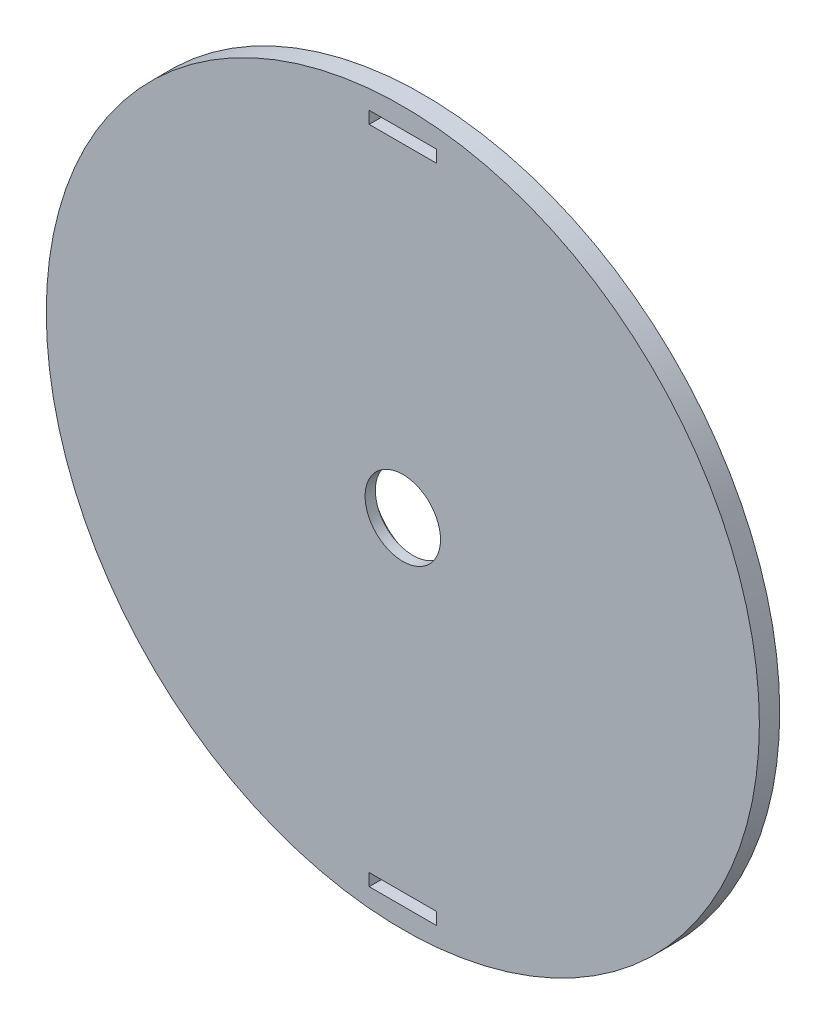
ISO-10303-21;
HEADER;
FILE_DESCRIPTION(('STEP AP214'),'2;1');
FILE_NAME('part.step','',(''),(''),'','','');
FILE_SCHEMA(('AUTOMOTIVE_DESIGN { 1 0 10303 214 1 1 1 1 }'));
ENDSEC;
DATA;
#1=APPLICATION_CONTEXT('core data for automotive mechanical design processes');
#2=APPLICATION_PROTOCOL_DEFINITION('international standard','automotive_design',2000,#1);
#3=PRODUCT_CONTEXT('',#1,'mechanical');
#4=PRODUCT('Part','Part','',(#3));
#5=PRODUCT_RELATED_PRODUCT_CATEGORY('part','',(#4));
#6=PRODUCT_DEFINITION_FORMATION('','',#4);
#7=PRODUCT_DEFINITION_CONTEXT('part definition',#1,'design');
#8=PRODUCT_DEFINITION('design','',#6,#7);
#9=PRODUCT_DEFINITION_SHAPE('','',#8);
#10=(LENGTH_UNIT() NAMED_UNIT(*) SI_UNIT(.MILLI.,.METRE.));
#11=(NAMED_UNIT(*) PLANE_ANGLE_UNIT() SI_UNIT($,.RADIAN.));
#12=(NAMED_UNIT(*) SI_UNIT($,.STERADIAN.) SOLID_ANGLE_UNIT());
#13=UNCERTAINTY_MEASURE_WITH_UNIT(LENGTH_MEASURE(1.E-05),#10,'distance_accuracy_value','');
#14=(GEOMETRIC_REPRESENTATION_CONTEXT(3) GLOBAL_UNCERTAINTY_ASSIGNED_CONTEXT((#13)) GLOBAL_UNIT_ASSIGNED_CONTEXT((#10,
#11,#12)) REPRESENTATION_CONTEXT('',''));
#15=CARTESIAN_POINT('',(0.,0.,0.));
#16=DIRECTION('',(0.,0.,1.));
#17=DIRECTION('',(1.,0.,0.));
#18=AXIS2_PLACEMENT_3D('',#15,#16,#17);
#19=CARTESIAN_POINT('',(0.,0.,5.));
#20=DIRECTION('',(0.,0.,-1.));
#21=DIRECTION('',(-1.,0.,0.));
#22=AXIS2_PLACEMENT_3D('',#19,#20,#21);
#23=CYLINDRICAL_SURFACE('',#22,87.5);
#24=CARTESIAN_POINT('',(0.,0.,5.));
#25=DIRECTION('',(0.,0.,1.));
#26=DIRECTION('',(1.,0.,0.));
#27=AXIS2_PLACEMENT_3D('',#24,#25,#26);
#28=CIRCLE('',#27,87.5);
#29=CARTESIAN_POINT('',(87.5,0.,5.));
#30=VERTEX_POINT('',#29);
#31=EDGE_CURVE('E11',#30,#30,#28,.T.);
#32=ORIENTED_EDGE('',*,*,#31,.F.);
#33=EDGE_LOOP('',(#32));
#34=FACE_BOUND('',#33,.T.);
#35=CARTESIAN_POINT('',(0.,0.,0.));
#36=DIRECTION('',(0.,0.,1.));
#37=DIRECTION('',(1.,0.,0.));
#38=AXIS2_PLACEMENT_3D('',#35,#36,#37);
#39=CIRCLE('',#38,87.5);
#40=CARTESIAN_POINT('',(87.5,0.,0.));
#41=VERTEX_POINT('',#40);
#42=EDGE_CURVE('E44',#41,#41,#39,.T.);
#43=ORIENTED_EDGE('',*,*,#42,.T.);
#44=EDGE_LOOP('',(#43));
#45=FACE_BOUND('',#44,.T.);
#46=ADVANCED_FACE('F41',(#34,#45),#23,.T.);
#47=CARTESIAN_POINT('',(0.,0.,5.));
#48=DIRECTION('',(0.,0.,1.));
#49=DIRECTION('',(1.,0.,0.));
#50=AXIS2_PLACEMENT_3D('',#47,#48,#49);
#51=PLANE('',#50);
#52=CARTESIAN_POINT('',(0.,0.,5.));
#53=DIRECTION('',(0.,0.,1.));
#54=DIRECTION('',(1.,0.,0.));
#55=AXIS2_PLACEMENT_3D('',#52,#53,#54);
#56=CIRCLE('',#55,9.25);
#57=CARTESIAN_POINT('',(9.25,0.,5.));
#58=VERTEX_POINT('',#57);
#59=EDGE_CURVE('E180',#58,#58,#56,.T.);
#60=ORIENTED_EDGE('',*,*,#59,.F.);
#61=EDGE_LOOP('',(#60));
#62=FACE_BOUND('',#61,.T.);
#63=DIRECTION('',(0.,1.,0.));
#64=VECTOR('',#63,1.);
#65=CARTESIAN_POINT('',(8.25,0.,5.));
#66=LINE('',#65,#64);
#67=CARTESIAN_POINT('',(8.25,-82.5,5.));
#68=VERTEX_POINT('',#67);
#69=CARTESIAN_POINT('',(8.25,-79.5,5.));
#70=VERTEX_POINT('',#69);
#71=EDGE_CURVE('E247',#68,#70,#66,.T.);
#72=ORIENTED_EDGE('',*,*,#71,.F.);
#73=DIRECTION('',(1.,0.,0.));
#74=VECTOR('',#73,1.);
#75=CARTESIAN_POINT('',(0.,-82.5,5.));
#76=LINE('',#75,#74);
#77=CARTESIAN_POINT('',(-8.25,-82.5,5.));
#78=VERTEX_POINT('',#77);
#79=EDGE_CURVE('E234',#78,#68,#76,.T.);
#80=ORIENTED_EDGE('',*,*,#79,.F.);
#81=DIRECTION('',(0.,-1.,0.));
#82=VECTOR('',#81,1.);
#83=CARTESIAN_POINT('',(-8.25,0.,5.));
#84=LINE('',#83,#82);
#85=CARTESIAN_POINT('',(-8.25,-79.5,5.));
#86=VERTEX_POINT('',#85);
#87=EDGE_CURVE('E242',#86,#78,#84,.T.);
#88=ORIENTED_EDGE('',*,*,#87,.F.);
#89=DIRECTION('',(-1.,0.,0.));
#90=VECTOR('',#89,1.);
#91=CARTESIAN_POINT('',(0.,-79.5,5.));
#92=LINE('',#91,#90);
#93=EDGE_CURVE('E245',#70,#86,#92,.T.);
#94=ORIENTED_EDGE('',*,*,#93,.F.);
#95=EDGE_LOOP('',(#72,#80,#88,#94));
#96=FACE_BOUND('',#95,.T.);
#97=DIRECTION('',(0.,-1.,0.));
#98=VECTOR('',#97,1.);
#99=CARTESIAN_POINT('',(-8.25,0.,5.));
#100=LINE('',#99,#98);
#101=CARTESIAN_POINT('',(-8.25,82.5,5.));
#102=VERTEX_POINT('',#101);
#103=CARTESIAN_POINT('',(-8.25,79.5,5.));
#104=VERTEX_POINT('',#103);
#105=EDGE_CURVE('E278',#102,#104,#100,.T.);
#106=ORIENTED_EDGE('',*,*,#105,.F.);
#107=DIRECTION('',(-1.,0.,0.));
#108=VECTOR('',#107,1.);
#109=CARTESIAN_POINT('',(0.,82.5,5.));
#110=LINE('',#109,#108);
#111=CARTESIAN_POINT('',(8.25,82.5,5.));
#112=VERTEX_POINT('',#111);
#113=EDGE_CURVE('E265',#112,#102,#110,.T.);
#114=ORIENTED_EDGE('',*,*,#113,.F.);
#115=DIRECTION('',(0.,1.,0.));
#116=VECTOR('',#115,1.);
#117=CARTESIAN_POINT('',(8.25,0.,5.));
#118=LINE('',#117,#116);
#119=CARTESIAN_POINT('',(8.25,79.5,5.));
#120=VERTEX_POINT('',#119);
#121=EDGE_CURVE('E273',#120,#112,#118,.T.);
#122=ORIENTED_EDGE('',*,*,#121,.F.);
#123=DIRECTION('',(1.,0.,0.));
#124=VECTOR('',#123,1.);
#125=CARTESIAN_POINT('',(0.,79.5,5.));
#126=LINE('',#125,#124);
#127=EDGE_CURVE('E276',#104,#120,#126,.T.);
#128=ORIENTED_EDGE('',*,*,#127,.F.);
#129=EDGE_LOOP('',(#106,#114,#122,#128));
#130=FACE_BOUND('',#129,.T.);
#131=ORIENTED_EDGE('',*,*,#31,.T.);
#132=EDGE_LOOP('',(#131));
#133=FACE_BOUND('',#132,.T.);
#134=ADVANCED_FACE('F290',(#62,#96,#130,#133),#51,.T.);
#135=CARTESIAN_POINT('',(0.,0.,0.));
#136=DIRECTION('',(0.,0.,1.));
#137=DIRECTION('',(1.,0.,0.));
#138=AXIS2_PLACEMENT_3D('',#135,#136,#137);
#139=PLANE('',#138);
#140=CARTESIAN_POINT('',(0.,0.,0.));
#141=DIRECTION('',(0.,0.,-1.));
#142=DIRECTION('',(-1.,0.,0.));
#143=AXIS2_PLACEMENT_3D('',#140,#141,#142);
#144=CIRCLE('',#143,12.6);
#145=CARTESIAN_POINT('',(-12.6,0.,0.));
#146=VERTEX_POINT('',#145);
#147=EDGE_CURVE('E483',#146,#146,#144,.T.);
#148=ORIENTED_EDGE('',*,*,#147,.F.);
#149=EDGE_LOOP('',(#148));
#150=FACE_BOUND('',#149,.T.);
#151=DIRECTION('',(1.,0.,0.));
#152=VECTOR('',#151,1.);
#153=CARTESIAN_POINT('',(-8.05,-49.5,0.));
#154=LINE('',#153,#152);
#155=CARTESIAN_POINT('',(-8.05,-49.5,0.));
#156=VERTEX_POINT('',#155);
#157=CARTESIAN_POINT('',(8.05,-49.5,0.));
#158=VERTEX_POINT('',#157);
#159=EDGE_CURVE('E177',#156,#158,#154,.T.);
#160=ORIENTED_EDGE('',*,*,#159,.F.);
#161=DIRECTION('',(0.,1.,0.));
#162=VECTOR('',#161,1.);
#163=CARTESIAN_POINT('',(-8.05,-79.5,0.));
#164=LINE('',#163,#162);
#165=CARTESIAN_POINT('',(-8.05,-79.5,0.));
#166=VERTEX_POINT('',#165);
#167=EDGE_CURVE('E162',#166,#156,#164,.T.);
#168=ORIENTED_EDGE('',*,*,#167,.F.);
#169=DIRECTION('',(1.,0.,0.));
#170=VECTOR('',#169,1.);
#171=CARTESIAN_POINT('',(-8.25,-79.5,0.));
#172=LINE('',#171,#170);
#173=CARTESIAN_POINT('',(-8.25,-79.5,0.));
#174=VERTEX_POINT('',#173);
#175=EDGE_CURVE('E227',#174,#166,#172,.T.);
#176=ORIENTED_EDGE('',*,*,#175,.F.);
#177=DIRECTION('',(0.,1.,0.));
#178=VECTOR('',#177,1.);
#179=CARTESIAN_POINT('',(-8.25,-82.5,0.));
#180=LINE('',#179,#178);
#181=CARTESIAN_POINT('',(-8.25,-82.5,0.));
#182=VERTEX_POINT('',#181);
#183=EDGE_CURVE('E223',#182,#174,#180,.T.);
#184=ORIENTED_EDGE('',*,*,#183,.F.);
#185=DIRECTION('',(-1.,0.,0.));
#186=VECTOR('',#185,1.);
#187=CARTESIAN_POINT('',(-8.25,-82.5,0.));
#188=LINE('',#187,#186);
#189=CARTESIAN_POINT('',(8.25,-82.5,0.));
#190=VERTEX_POINT('',#189);
#191=EDGE_CURVE('E220',#190,#182,#188,.T.);
#192=ORIENTED_EDGE('',*,*,#191,.F.);
#193=DIRECTION('',(0.,-1.,0.));
#194=VECTOR('',#193,1.);
#195=CARTESIAN_POINT('',(8.25,-82.5,0.));
#196=LINE('',#195,#194);
#197=CARTESIAN_POINT('',(8.25,-79.5,0.));
#198=VERTEX_POINT('',#197);
#199=EDGE_CURVE('E212',#198,#190,#196,.T.);
#200=ORIENTED_EDGE('',*,*,#199,.F.);
#201=CARTESIAN_POINT('',(8.05,-79.5,0.));
#202=VERTEX_POINT('',#201);
#203=EDGE_CURVE('E226',#202,#198,#172,.T.);
#204=ORIENTED_EDGE('',*,*,#203,.F.);
#205=DIRECTION('',(0.,-1.,0.));
#206=VECTOR('',#205,1.);
#207=CARTESIAN_POINT('',(8.05,-79.5,0.));
#208=LINE('',#207,#206);
#209=EDGE_CURVE('E175',#158,#202,#208,.T.);
#210=ORIENTED_EDGE('',*,*,#209,.F.);
#211=EDGE_LOOP('',(#160,#168,#176,#184,#192,#200,#204,#210));
#212=FACE_BOUND('',#211,.T.);
#213=DIRECTION('',(-1.,0.,0.));
#214=VECTOR('',#213,1.);
#215=CARTESIAN_POINT('',(8.05,49.5,0.));
#216=LINE('',#215,#214);
#217=CARTESIAN_POINT('',(8.05,49.5,0.));
#218=VERTEX_POINT('',#217);
#219=CARTESIAN_POINT('',(-8.05,49.5,0.));
#220=VERTEX_POINT('',#219);
#221=EDGE_CURVE('E206',#218,#220,#216,.T.);
#222=ORIENTED_EDGE('',*,*,#221,.F.);
#223=DIRECTION('',(0.,-1.,0.));
#224=VECTOR('',#223,1.);
#225=CARTESIAN_POINT('',(8.05,79.5,0.));
#226=LINE('',#225,#224);
#227=CARTESIAN_POINT('',(8.05,79.5,0.));
#228=VERTEX_POINT('',#227);
#229=EDGE_CURVE('E189',#228,#218,#226,.T.);
#230=ORIENTED_EDGE('',*,*,#229,.F.);
#231=DIRECTION('',(-1.,0.,0.));
#232=VECTOR('',#231,1.);
#233=CARTESIAN_POINT('',(8.25,79.5,0.));
#234=LINE('',#233,#232);
#235=CARTESIAN_POINT('',(8.25,79.5,0.));
#236=VERTEX_POINT('',#235);
#237=EDGE_CURVE('E258',#236,#228,#234,.T.);
#238=ORIENTED_EDGE('',*,*,#237,.F.);
#239=DIRECTION('',(0.,-1.,0.));
#240=VECTOR('',#239,1.);
#241=CARTESIAN_POINT('',(8.25,82.5,0.));
#242=LINE('',#241,#240);
#243=CARTESIAN_POINT('',(8.25,82.5,0.));
#244=VERTEX_POINT('',#243);
#245=EDGE_CURVE('E254',#244,#236,#242,.T.);
#246=ORIENTED_EDGE('',*,*,#245,.F.);
#247=DIRECTION('',(1.,0.,0.));
#248=VECTOR('',#247,1.);
#249=CARTESIAN_POINT('',(8.25,82.5,0.));
#250=LINE('',#249,#248);
#251=CARTESIAN_POINT('',(-8.25,82.5,0.));
#252=VERTEX_POINT('',#251);
#253=EDGE_CURVE('E251',#252,#244,#250,.T.);
#254=ORIENTED_EDGE('',*,*,#253,.F.);
#255=DIRECTION('',(0.,1.,0.));
#256=VECTOR('',#255,1.);
#257=CARTESIAN_POINT('',(-8.25,82.5,0.));
#258=LINE('',#257,#256);
#259=CARTESIAN_POINT('',(-8.25,79.5,0.));
#260=VERTEX_POINT('',#259);
#261=EDGE_CURVE('E249',#260,#252,#258,.T.);
#262=ORIENTED_EDGE('',*,*,#261,.F.);
#263=CARTESIAN_POINT('',(-8.05,79.5,0.));
#264=VERTEX_POINT('',#263);
#265=EDGE_CURVE('E257',#264,#260,#234,.T.);
#266=ORIENTED_EDGE('',*,*,#265,.F.);
#267=DIRECTION('',(0.,1.,0.));
#268=VECTOR('',#267,1.);
#269=CARTESIAN_POINT('',(-8.05,79.5,0.));
#270=LINE('',#269,#268);
#271=EDGE_CURVE('E198',#220,#264,#270,.T.);
#272=ORIENTED_EDGE('',*,*,#271,.F.);
#273=EDGE_LOOP('',(#222,#230,#238,#246,#254,#262,#266,#272));
#274=FACE_BOUND('',#273,.T.);
#275=ORIENTED_EDGE('',*,*,#42,.F.);
#276=EDGE_LOOP('',(#275));
#277=FACE_BOUND('',#276,.T.);
#278=ADVANCED_FACE('F287',(#150,#212,#274,#277),#139,.F.);
#279=CARTESIAN_POINT('',(-8.25,82.5,10.));
#280=DIRECTION('',(-1.,0.,0.));
#281=DIRECTION('',(0.,0.,1.));
#282=AXIS2_PLACEMENT_3D('',#279,#280,#281);
#283=PLANE('',#282);
#284=ORIENTED_EDGE('',*,*,#105,.T.);
#285=DIRECTION('',(0.,0.,-1.));
#286=VECTOR('',#285,1.);
#287=CARTESIAN_POINT('',(-8.25,79.5,10.));
#288=LINE('',#287,#286);
#289=EDGE_CURVE('E262',#104,#260,#288,.T.);
#290=ORIENTED_EDGE('',*,*,#289,.T.);
#291=ORIENTED_EDGE('',*,*,#261,.T.);
#292=DIRECTION('',(0.,0.,-1.));
#293=VECTOR('',#292,1.);
#294=CARTESIAN_POINT('',(-8.25,82.5,10.));
#295=LINE('',#294,#293);
#296=EDGE_CURVE('E261',#102,#252,#295,.T.);
#297=ORIENTED_EDGE('',*,*,#296,.F.);
#298=EDGE_LOOP('',(#284,#290,#291,#297));
#299=FACE_BOUND('',#298,.T.);
#300=ADVANCED_FACE('F289',(#299),#283,.F.);
#301=CARTESIAN_POINT('',(8.25,79.5,10.));
#302=DIRECTION('',(0.,-1.,0.));
#303=DIRECTION('',(0.,0.,-1.));
#304=AXIS2_PLACEMENT_3D('',#301,#302,#303);
#305=PLANE('',#304);
#306=ORIENTED_EDGE('',*,*,#237,.T.);
#307=DIRECTION('',(0.,0.,-1.));
#308=VECTOR('',#307,1.);
#309=CARTESIAN_POINT('',(8.05,79.5,2.));
#310=LINE('',#309,#308);
#311=CARTESIAN_POINT('',(8.05,79.5,2.));
#312=VERTEX_POINT('',#311);
#313=EDGE_CURVE('E210',#312,#228,#310,.T.);
#314=ORIENTED_EDGE('',*,*,#313,.F.);
#315=DIRECTION('',(1.,0.,0.));
#316=VECTOR('',#315,1.);
#317=CARTESIAN_POINT('',(8.05,79.5,2.));
#318=LINE('',#317,#316);
#319=CARTESIAN_POINT('',(-8.05,79.5,2.));
#320=VERTEX_POINT('',#319);
#321=EDGE_CURVE('E201',#320,#312,#318,.T.);
#322=ORIENTED_EDGE('',*,*,#321,.F.);
#323=DIRECTION('',(0.,0.,-1.));
#324=VECTOR('',#323,1.);
#325=CARTESIAN_POINT('',(-8.05,79.5,2.));
#326=LINE('',#325,#324);
#327=EDGE_CURVE('E213',#320,#264,#326,.T.);
#328=ORIENTED_EDGE('',*,*,#327,.T.);
#329=ORIENTED_EDGE('',*,*,#265,.T.);
#330=ORIENTED_EDGE('',*,*,#289,.F.);
#331=ORIENTED_EDGE('',*,*,#127,.T.);
#332=DIRECTION('',(0.,0.,-1.));
#333=VECTOR('',#332,1.);
#334=CARTESIAN_POINT('',(8.25,79.5,10.));
#335=LINE('',#334,#333);
#336=EDGE_CURVE('E266',#120,#236,#335,.T.);
#337=ORIENTED_EDGE('',*,*,#336,.T.);
#338=EDGE_LOOP('',(#306,#314,#322,#328,#329,#330,#331,#337));
#339=FACE_BOUND('',#338,.T.);
#340=ADVANCED_FACE('F297',(#339),#305,.F.);
#341=CARTESIAN_POINT('',(8.25,82.5,10.));
#342=DIRECTION('',(1.,0.,0.));
#343=DIRECTION('',(0.,0.,-1.));
#344=AXIS2_PLACEMENT_3D('',#341,#342,#343);
#345=PLANE('',#344);
#346=ORIENTED_EDGE('',*,*,#121,.T.);
#347=DIRECTION('',(0.,0.,-1.));
#348=VECTOR('',#347,1.);
#349=CARTESIAN_POINT('',(8.25,82.5,10.));
#350=LINE('',#349,#348);
#351=EDGE_CURVE('E268',#112,#244,#350,.T.);
#352=ORIENTED_EDGE('',*,*,#351,.T.);
#353=ORIENTED_EDGE('',*,*,#245,.T.);
#354=ORIENTED_EDGE('',*,*,#336,.F.);
#355=EDGE_LOOP('',(#346,#352,#353,#354));
#356=FACE_BOUND('',#355,.T.);
#357=ADVANCED_FACE('F321',(#356),#345,.F.);
#358=CARTESIAN_POINT('',(8.25,82.5,10.));
#359=DIRECTION('',(0.,1.,0.));
#360=DIRECTION('',(0.,0.,1.));
#361=AXIS2_PLACEMENT_3D('',#358,#359,#360);
#362=PLANE('',#361);
#363=ORIENTED_EDGE('',*,*,#113,.T.);
#364=ORIENTED_EDGE('',*,*,#296,.T.);
#365=ORIENTED_EDGE('',*,*,#253,.T.);
#366=ORIENTED_EDGE('',*,*,#351,.F.);
#367=EDGE_LOOP('',(#363,#364,#365,#366));
#368=FACE_BOUND('',#367,.T.);
#369=ADVANCED_FACE('F325',(#368),#362,.F.);
#370=CARTESIAN_POINT('',(8.25,-82.5,10.));
#371=DIRECTION('',(1.,0.,0.));
#372=DIRECTION('',(0.,0.,-1.));
#373=AXIS2_PLACEMENT_3D('',#370,#371,#372);
#374=PLANE('',#373);
#375=ORIENTED_EDGE('',*,*,#71,.T.);
#376=DIRECTION('',(0.,0.,-1.));
#377=VECTOR('',#376,1.);
#378=CARTESIAN_POINT('',(8.25,-79.5,10.));
#379=LINE('',#378,#377);
#380=EDGE_CURVE('E231',#70,#198,#379,.T.);
#381=ORIENTED_EDGE('',*,*,#380,.T.);
#382=ORIENTED_EDGE('',*,*,#199,.T.);
#383=DIRECTION('',(0.,0.,-1.));
#384=VECTOR('',#383,1.);
#385=CARTESIAN_POINT('',(8.25,-82.5,10.));
#386=LINE('',#385,#384);
#387=EDGE_CURVE('E230',#68,#190,#386,.T.);
#388=ORIENTED_EDGE('',*,*,#387,.F.);
#389=EDGE_LOOP('',(#375,#381,#382,#388));
#390=FACE_BOUND('',#389,.T.);
#391=ADVANCED_FACE('F334',(#390),#374,.F.);
#392=CARTESIAN_POINT('',(-8.25,-79.5,10.));
#393=DIRECTION('',(0.,1.,0.));
#394=DIRECTION('',(0.,0.,1.));
#395=AXIS2_PLACEMENT_3D('',#392,#393,#394);
#396=PLANE('',#395);
#397=ORIENTED_EDGE('',*,*,#175,.T.);
#398=DIRECTION('',(0.,0.,-1.));
#399=VECTOR('',#398,1.);
#400=CARTESIAN_POINT('',(-8.05,-79.5,2.));
#401=LINE('',#400,#399);
#402=CARTESIAN_POINT('',(-8.05,-79.5,2.));
#403=VERTEX_POINT('',#402);
#404=EDGE_CURVE('E187',#403,#166,#401,.T.);
#405=ORIENTED_EDGE('',*,*,#404,.F.);
#406=DIRECTION('',(-1.,0.,0.));
#407=VECTOR('',#406,1.);
#408=CARTESIAN_POINT('',(-8.05,-79.5,2.));
#409=LINE('',#408,#407);
#410=CARTESIAN_POINT('',(8.05,-79.5,2.));
#411=VERTEX_POINT('',#410);
#412=EDGE_CURVE('E167',#411,#403,#409,.T.);
#413=ORIENTED_EDGE('',*,*,#412,.F.);
#414=DIRECTION('',(0.,0.,-1.));
#415=VECTOR('',#414,1.);
#416=CARTESIAN_POINT('',(8.05,-79.5,2.));
#417=LINE('',#416,#415);
#418=EDGE_CURVE('E190',#411,#202,#417,.T.);
#419=ORIENTED_EDGE('',*,*,#418,.T.);
#420=ORIENTED_EDGE('',*,*,#203,.T.);
#421=ORIENTED_EDGE('',*,*,#380,.F.);
#422=ORIENTED_EDGE('',*,*,#93,.T.);
#423=DIRECTION('',(0.,0.,-1.));
#424=VECTOR('',#423,1.);
#425=CARTESIAN_POINT('',(-8.25,-79.5,10.));
#426=LINE('',#425,#424);
#427=EDGE_CURVE('E235',#86,#174,#426,.T.);
#428=ORIENTED_EDGE('',*,*,#427,.T.);
#429=EDGE_LOOP('',(#397,#405,#413,#419,#420,#421,#422,#428));
#430=FACE_BOUND('',#429,.T.);
#431=ADVANCED_FACE('F343',(#430),#396,.F.);
#432=CARTESIAN_POINT('',(-8.25,-82.5,10.));
#433=DIRECTION('',(-1.,0.,0.));
#434=DIRECTION('',(0.,0.,1.));
#435=AXIS2_PLACEMENT_3D('',#432,#433,#434);
#436=PLANE('',#435);
#437=ORIENTED_EDGE('',*,*,#87,.T.);
#438=DIRECTION('',(0.,0.,-1.));
#439=VECTOR('',#438,1.);
#440=CARTESIAN_POINT('',(-8.25,-82.5,10.));
#441=LINE('',#440,#439);
#442=EDGE_CURVE('E237',#78,#182,#441,.T.);
#443=ORIENTED_EDGE('',*,*,#442,.T.);
#444=ORIENTED_EDGE('',*,*,#183,.T.);
#445=ORIENTED_EDGE('',*,*,#427,.F.);
#446=EDGE_LOOP('',(#437,#443,#444,#445));
#447=FACE_BOUND('',#446,.T.);
#448=ADVANCED_FACE('F350',(#447),#436,.F.);
#449=CARTESIAN_POINT('',(-8.25,-82.5,10.));
#450=DIRECTION('',(0.,-1.,0.));
#451=DIRECTION('',(0.,0.,-1.));
#452=AXIS2_PLACEMENT_3D('',#449,#450,#451);
#453=PLANE('',#452);
#454=ORIENTED_EDGE('',*,*,#79,.T.);
#455=ORIENTED_EDGE('',*,*,#387,.T.);
#456=ORIENTED_EDGE('',*,*,#191,.T.);
#457=ORIENTED_EDGE('',*,*,#442,.F.);
#458=EDGE_LOOP('',(#454,#455,#456,#457));
#459=FACE_BOUND('',#458,.T.);
#460=ADVANCED_FACE('F354',(#459),#453,.F.);
#461=CARTESIAN_POINT('',(8.05,79.5,2.));
#462=DIRECTION('',(1.,0.,0.));
#463=DIRECTION('',(0.,1.,0.));
#464=AXIS2_PLACEMENT_3D('',#461,#462,#463);
#465=PLANE('',#464);
#466=ORIENTED_EDGE('',*,*,#229,.T.);
#467=DIRECTION('',(0.,0.,-1.));
#468=VECTOR('',#467,1.);
#469=CARTESIAN_POINT('',(8.05,49.5,2.));
#470=LINE('',#469,#468);
#471=CARTESIAN_POINT('',(8.05,49.5,2.));
#472=VERTEX_POINT('',#471);
#473=EDGE_CURVE('E203',#472,#218,#470,.T.);
#474=ORIENTED_EDGE('',*,*,#473,.F.);
#475=DIRECTION('',(0.,-1.,0.));
#476=VECTOR('',#475,1.);
#477=CARTESIAN_POINT('',(8.05,79.5,2.));
#478=LINE('',#477,#476);
#479=EDGE_CURVE('E194',#312,#472,#478,.T.);
#480=ORIENTED_EDGE('',*,*,#479,.F.);
#481=ORIENTED_EDGE('',*,*,#313,.T.);
#482=EDGE_LOOP('',(#466,#474,#480,#481));
#483=FACE_BOUND('',#482,.T.);
#484=ADVANCED_FACE('F363',(#483),#465,.F.);
#485=CARTESIAN_POINT('',(-8.05,79.5,2.));
#486=DIRECTION('',(-1.,0.,0.));
#487=DIRECTION('',(0.,-1.,0.));
#488=AXIS2_PLACEMENT_3D('',#485,#486,#487);
#489=PLANE('',#488);
#490=ORIENTED_EDGE('',*,*,#271,.T.);
#491=ORIENTED_EDGE('',*,*,#327,.F.);
#492=DIRECTION('',(0.,1.,0.));
#493=VECTOR('',#492,1.);
#494=CARTESIAN_POINT('',(-8.05,79.5,2.));
#495=LINE('',#494,#493);
#496=CARTESIAN_POINT('',(-8.05,49.5,2.));
#497=VERTEX_POINT('',#496);
#498=EDGE_CURVE('E63',#497,#320,#495,.T.);
#499=ORIENTED_EDGE('',*,*,#498,.F.);
#500=DIRECTION('',(0.,0.,-1.));
#501=VECTOR('',#500,1.);
#502=CARTESIAN_POINT('',(-8.05,49.5,2.));
#503=LINE('',#502,#501);
#504=EDGE_CURVE('E216',#497,#220,#503,.T.);
#505=ORIENTED_EDGE('',*,*,#504,.T.);
#506=EDGE_LOOP('',(#490,#491,#499,#505));
#507=FACE_BOUND('',#506,.T.);
#508=ADVANCED_FACE('F379',(#507),#489,.F.);
#509=CARTESIAN_POINT('',(8.05,49.5,2.));
#510=DIRECTION('',(0.,-1.,0.));
#511=DIRECTION('',(0.,0.,-1.));
#512=AXIS2_PLACEMENT_3D('',#509,#510,#511);
#513=PLANE('',#512);
#514=ORIENTED_EDGE('',*,*,#221,.T.);
#515=ORIENTED_EDGE('',*,*,#504,.F.);
#516=DIRECTION('',(-1.,0.,0.));
#517=VECTOR('',#516,1.);
#518=CARTESIAN_POINT('',(8.05,49.5,2.));
#519=LINE('',#518,#517);
#520=EDGE_CURVE('E197',#472,#497,#519,.T.);
#521=ORIENTED_EDGE('',*,*,#520,.F.);
#522=ORIENTED_EDGE('',*,*,#473,.T.);
#523=EDGE_LOOP('',(#514,#515,#521,#522));
#524=FACE_BOUND('',#523,.T.);
#525=ADVANCED_FACE('F388',(#524),#513,.F.);
#526=CARTESIAN_POINT('',(0.,0.,2.));
#527=DIRECTION('',(0.,0.,-1.));
#528=DIRECTION('',(-1.,0.,0.));
#529=AXIS2_PLACEMENT_3D('',#526,#527,#528);
#530=PLANE('',#529);
#531=ORIENTED_EDGE('',*,*,#479,.T.);
#532=ORIENTED_EDGE('',*,*,#520,.T.);
#533=ORIENTED_EDGE('',*,*,#498,.T.);
#534=ORIENTED_EDGE('',*,*,#321,.T.);
#535=EDGE_LOOP('',(#531,#532,#533,#534));
#536=FACE_BOUND('',#535,.T.);
#537=ADVANCED_FACE('F397',(#536),#530,.T.);
#538=CARTESIAN_POINT('',(-8.05,-79.5,2.));
#539=DIRECTION('',(-1.,0.,0.));
#540=DIRECTION('',(0.,-1.,0.));
#541=AXIS2_PLACEMENT_3D('',#538,#539,#540);
#542=PLANE('',#541);
#543=ORIENTED_EDGE('',*,*,#167,.T.);
#544=DIRECTION('',(0.,0.,-1.));
#545=VECTOR('',#544,1.);
#546=CARTESIAN_POINT('',(-8.05,-49.5,2.));
#547=LINE('',#546,#545);
#548=CARTESIAN_POINT('',(-8.05,-49.5,2.));
#549=VERTEX_POINT('',#548);
#550=EDGE_CURVE('E156',#549,#156,#547,.T.);
#551=ORIENTED_EDGE('',*,*,#550,.F.);
#552=DIRECTION('',(0.,1.,0.));
#553=VECTOR('',#552,1.);
#554=CARTESIAN_POINT('',(-8.05,-79.5,2.));
#555=LINE('',#554,#553);
#556=EDGE_CURVE('E160',#403,#549,#555,.T.);
#557=ORIENTED_EDGE('',*,*,#556,.F.);
#558=ORIENTED_EDGE('',*,*,#404,.T.);
#559=EDGE_LOOP('',(#543,#551,#557,#558));
#560=FACE_BOUND('',#559,.T.);
#561=ADVANCED_FACE('F158',(#560),#542,.F.);
#562=CARTESIAN_POINT('',(8.05,-79.5,2.));
#563=DIRECTION('',(1.,0.,0.));
#564=DIRECTION('',(0.,1.,0.));
#565=AXIS2_PLACEMENT_3D('',#562,#563,#564);
#566=PLANE('',#565);
#567=ORIENTED_EDGE('',*,*,#209,.T.);
#568=ORIENTED_EDGE('',*,*,#418,.F.);
#569=DIRECTION('',(0.,-1.,0.));
#570=VECTOR('',#569,1.);
#571=CARTESIAN_POINT('',(8.05,-79.5,2.));
#572=LINE('',#571,#570);
#573=CARTESIAN_POINT('',(8.05,-49.5,2.));
#574=VERTEX_POINT('',#573);
#575=EDGE_CURVE('E55',#574,#411,#572,.T.);
#576=ORIENTED_EDGE('',*,*,#575,.F.);
#577=DIRECTION('',(0.,0.,-1.));
#578=VECTOR('',#577,1.);
#579=CARTESIAN_POINT('',(8.05,-49.5,2.));
#580=LINE('',#579,#578);
#581=EDGE_CURVE('E166',#574,#158,#580,.T.);
#582=ORIENTED_EDGE('',*,*,#581,.T.);
#583=EDGE_LOOP('',(#567,#568,#576,#582));
#584=FACE_BOUND('',#583,.T.);
#585=ADVANCED_FACE('F420',(#584),#566,.F.);
#586=CARTESIAN_POINT('',(-8.05,-49.5,2.));
#587=DIRECTION('',(0.,1.,0.));
#588=DIRECTION('',(0.,0.,1.));
#589=AXIS2_PLACEMENT_3D('',#586,#587,#588);
#590=PLANE('',#589);
#591=ORIENTED_EDGE('',*,*,#159,.T.);
#592=ORIENTED_EDGE('',*,*,#581,.F.);
#593=DIRECTION('',(1.,0.,0.));
#594=VECTOR('',#593,1.);
#595=CARTESIAN_POINT('',(-8.05,-49.5,2.));
#596=LINE('',#595,#594);
#597=EDGE_CURVE('E169',#549,#574,#596,.T.);
#598=ORIENTED_EDGE('',*,*,#597,.F.);
#599=ORIENTED_EDGE('',*,*,#550,.T.);
#600=EDGE_LOOP('',(#591,#592,#598,#599));
#601=FACE_BOUND('',#600,.T.);
#602=ADVANCED_FACE('F170',(#601),#590,.F.);
#603=CARTESIAN_POINT('',(0.,0.,2.));
#604=DIRECTION('',(0.,0.,-1.));
#605=DIRECTION('',(1.,0.,0.));
#606=AXIS2_PLACEMENT_3D('',#603,#604,#605);
#607=PLANE('',#606);
#608=ORIENTED_EDGE('',*,*,#556,.T.);
#609=ORIENTED_EDGE('',*,*,#597,.T.);
#610=ORIENTED_EDGE('',*,*,#575,.T.);
#611=ORIENTED_EDGE('',*,*,#412,.T.);
#612=EDGE_LOOP('',(#608,#609,#610,#611));
#613=FACE_BOUND('',#612,.T.);
#614=ADVANCED_FACE('F172',(#613),#607,.T.);
#615=CARTESIAN_POINT('',(0.,0.,2.5));
#616=DIRECTION('',(0.,0.,1.));
#617=DIRECTION('',(1.,0.,0.));
#618=AXIS2_PLACEMENT_3D('',#615,#616,#617);
#619=CYLINDRICAL_SURFACE('',#618,9.25);
#620=CARTESIAN_POINT('',(0.,0.,2.5));
#621=DIRECTION('',(0.,0.,1.));
#622=DIRECTION('',(1.,0.,0.));
#623=AXIS2_PLACEMENT_3D('',#620,#621,#622);
#624=CIRCLE('',#623,9.25);
#625=CARTESIAN_POINT('',(9.25,0.,2.5));
#626=VERTEX_POINT('',#625);
#627=EDGE_CURVE('E485',#626,#626,#624,.T.);
#628=ORIENTED_EDGE('',*,*,#627,.F.);
#629=EDGE_LOOP('',(#628));
#630=FACE_BOUND('',#629,.T.);
#631=ORIENTED_EDGE('',*,*,#59,.T.);
#632=EDGE_LOOP('',(#631));
#633=FACE_BOUND('',#632,.T.);
#634=ADVANCED_FACE('F442',(#630,#633),#619,.F.);
#635=CARTESIAN_POINT('',(0.,0.,2.5));
#636=DIRECTION('',(0.,0.,-1.));
#637=DIRECTION('',(-1.,0.,0.));
#638=AXIS2_PLACEMENT_3D('',#635,#636,#637);
#639=PLANE('',#638);
#640=CARTESIAN_POINT('',(0.,0.,2.5));
#641=DIRECTION('',(0.,0.,-1.));
#642=DIRECTION('',(-1.,0.,0.));
#643=AXIS2_PLACEMENT_3D('',#640,#641,#642);
#644=CIRCLE('',#643,12.6);
#645=CARTESIAN_POINT('',(-12.6,0.,2.5));
#646=VERTEX_POINT('',#645);
#647=EDGE_CURVE('E481',#646,#646,#644,.T.);
#648=ORIENTED_EDGE('',*,*,#647,.T.);
#649=EDGE_LOOP('',(#648));
#650=FACE_BOUND('',#649,.T.);
#651=ORIENTED_EDGE('',*,*,#627,.T.);
#652=EDGE_LOOP('',(#651));
#653=FACE_BOUND('',#652,.T.);
#654=ADVANCED_FACE('F453',(#650,#653),#639,.T.);
#655=CARTESIAN_POINT('',(0.,0.,2.5));
#656=DIRECTION('',(0.,0.,-1.));
#657=DIRECTION('',(-1.,0.,0.));
#658=AXIS2_PLACEMENT_3D('',#655,#656,#657);
#659=CYLINDRICAL_SURFACE('',#658,12.6);
#660=ORIENTED_EDGE('',*,*,#647,.F.);
#661=EDGE_LOOP('',(#660));
#662=FACE_BOUND('',#661,.T.);
#663=ORIENTED_EDGE('',*,*,#147,.T.);
#664=EDGE_LOOP('',(#663));
#665=FACE_BOUND('',#664,.T.);
#666=ADVANCED_FACE('F465',(#662,#665),#659,.F.);
#667=CLOSED_SHELL('',(#46,#134,#278,#300,#340,#357,#369,#391,#431,#448,#460,#484,#508,#525,#537,
#561,#585,#602,#614,#634,#654,#666));
#668=MANIFOLD_SOLID_BREP('B2',#667);
#669=ADVANCED_BREP_SHAPE_REPRESENTATION('',(#18,#668),#14);
#670=SHAPE_DEFINITION_REPRESENTATION(#9,#669);
ENDSEC;
END-ISO-10303-21;
